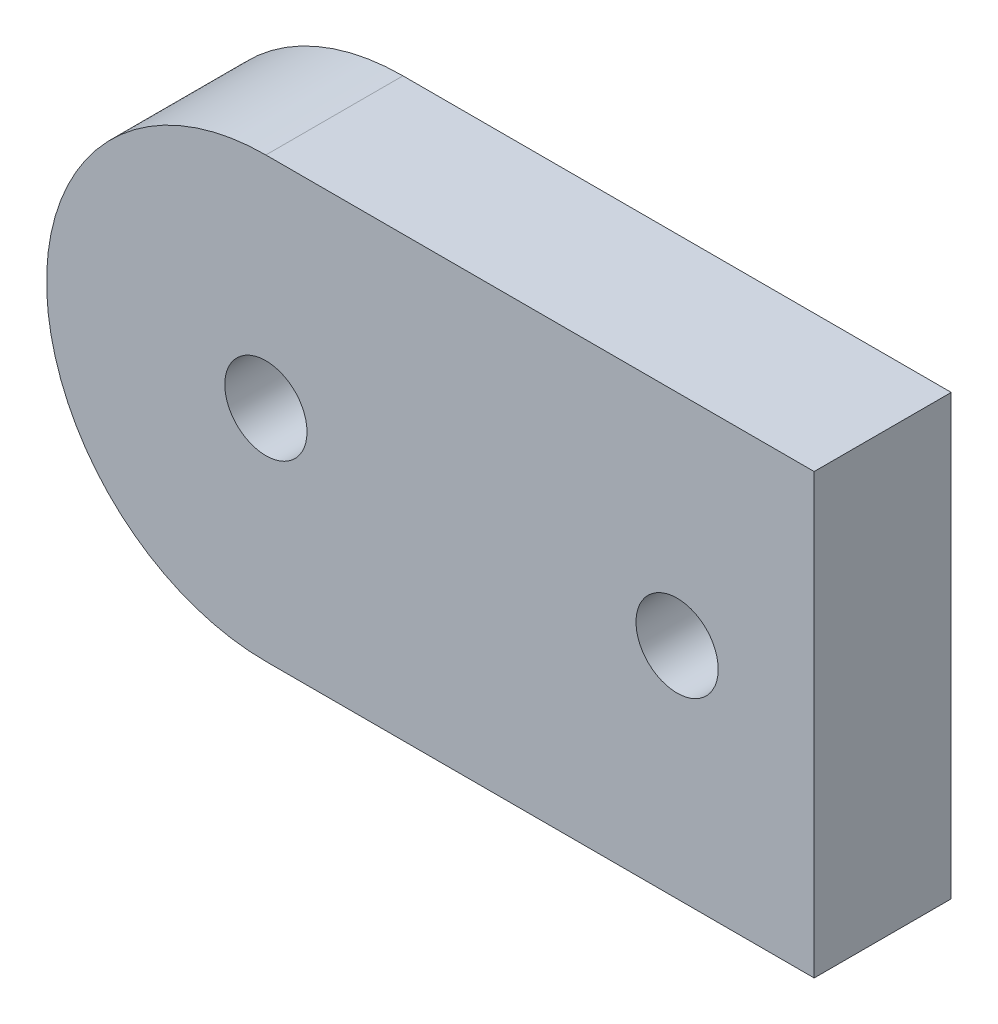
ISO-10303-21;
HEADER;
FILE_DESCRIPTION(('STEP AP214'),'2;1');
FILE_NAME('part.step','',(''),(''),'','','');
FILE_SCHEMA(('AUTOMOTIVE_DESIGN { 1 0 10303 214 1 1 1 1 }'));
ENDSEC;
DATA;
#1=APPLICATION_CONTEXT('core data for automotive mechanical design processes');
#2=APPLICATION_PROTOCOL_DEFINITION('international standard','automotive_design',2000,#1);
#3=PRODUCT_CONTEXT('',#1,'mechanical');
#4=PRODUCT('Part','Part','',(#3));
#5=PRODUCT_RELATED_PRODUCT_CATEGORY('part','',(#4));
#6=PRODUCT_DEFINITION_FORMATION('','',#4);
#7=PRODUCT_DEFINITION_CONTEXT('part definition',#1,'design');
#8=PRODUCT_DEFINITION('design','',#6,#7);
#9=PRODUCT_DEFINITION_SHAPE('','',#8);
#10=(LENGTH_UNIT() NAMED_UNIT(*) SI_UNIT(.MILLI.,.METRE.));
#11=(NAMED_UNIT(*) PLANE_ANGLE_UNIT() SI_UNIT($,.RADIAN.));
#12=(NAMED_UNIT(*) SI_UNIT($,.STERADIAN.) SOLID_ANGLE_UNIT());
#13=UNCERTAINTY_MEASURE_WITH_UNIT(LENGTH_MEASURE(1.E-05),#10,'distance_accuracy_value','');
#14=(GEOMETRIC_REPRESENTATION_CONTEXT(3) GLOBAL_UNCERTAINTY_ASSIGNED_CONTEXT((#13)) GLOBAL_UNIT_ASSIGNED_CONTEXT((#10,
#11,#12)) REPRESENTATION_CONTEXT('',''));
#15=CARTESIAN_POINT('',(0.,0.,0.));
#16=DIRECTION('',(0.,0.,1.));
#17=DIRECTION('',(1.,0.,0.));
#18=AXIS2_PLACEMENT_3D('',#15,#16,#17);
#19=CARTESIAN_POINT('',(0.,0.,5.));
#20=DIRECTION('',(0.,0.,1.));
#21=DIRECTION('',(1.,0.,0.));
#22=AXIS2_PLACEMENT_3D('',#19,#20,#21);
#23=PLANE('',#22);
#24=CARTESIAN_POINT('',(0.,0.,5.));
#25=DIRECTION('',(0.,0.,1.));
#26=DIRECTION('',(1.,0.,0.));
#27=AXIS2_PLACEMENT_3D('',#24,#25,#26);
#28=CIRCLE('',#27,1.5);
#29=CARTESIAN_POINT('',(1.5,0.,5.));
#30=VERTEX_POINT('',#29);
#31=EDGE_CURVE('E100',#30,#30,#28,.T.);
#32=ORIENTED_EDGE('',*,*,#31,.F.);
#33=EDGE_LOOP('',(#32));
#34=FACE_BOUND('',#33,.T.);
#35=CARTESIAN_POINT('',(0.,0.,5.));
#36=DIRECTION('',(0.,0.,1.));
#37=DIRECTION('',(1.,0.,0.));
#38=AXIS2_PLACEMENT_3D('',#35,#36,#37);
#39=CIRCLE('',#38,8.);
#40=CARTESIAN_POINT('',(0.,8.,5.));
#41=VERTEX_POINT('',#40);
#42=CARTESIAN_POINT('',(0.,-8.,5.));
#43=VERTEX_POINT('',#42);
#44=EDGE_CURVE('E85',#41,#43,#39,.T.);
#45=ORIENTED_EDGE('',*,*,#44,.T.);
#46=DIRECTION('',(1.,0.,0.));
#47=VECTOR('',#46,1.);
#48=CARTESIAN_POINT('',(0.,-8.,5.));
#49=LINE('',#48,#47);
#50=CARTESIAN_POINT('',(20.,-8.,5.));
#51=VERTEX_POINT('',#50);
#52=EDGE_CURVE('E80',#43,#51,#49,.T.);
#53=ORIENTED_EDGE('',*,*,#52,.T.);
#54=DIRECTION('',(0.,1.,0.));
#55=VECTOR('',#54,1.);
#56=CARTESIAN_POINT('',(20.,-8.,5.));
#57=LINE('',#56,#55);
#58=CARTESIAN_POINT('',(20.,8.,5.));
#59=VERTEX_POINT('',#58);
#60=EDGE_CURVE('E83',#51,#59,#57,.T.);
#61=ORIENTED_EDGE('',*,*,#60,.T.);
#62=DIRECTION('',(-1.,0.,0.));
#63=VECTOR('',#62,1.);
#64=CARTESIAN_POINT('',(0.,8.,5.));
#65=LINE('',#64,#63);
#66=EDGE_CURVE('E50',#59,#41,#65,.T.);
#67=ORIENTED_EDGE('',*,*,#66,.T.);
#68=EDGE_LOOP('',(#45,#53,#61,#67));
#69=FACE_BOUND('',#68,.T.);
#70=CARTESIAN_POINT('',(15.,0.,5.));
#71=DIRECTION('',(0.,0.,1.));
#72=DIRECTION('',(1.,0.,0.));
#73=AXIS2_PLACEMENT_3D('',#70,#71,#72);
#74=CIRCLE('',#73,1.5);
#75=CARTESIAN_POINT('',(16.5,0.,5.));
#76=VERTEX_POINT('',#75);
#77=EDGE_CURVE('E115',#76,#76,#74,.T.);
#78=ORIENTED_EDGE('',*,*,#77,.F.);
#79=EDGE_LOOP('',(#78));
#80=FACE_BOUND('',#79,.T.);
#81=ADVANCED_FACE('F33',(#34,#69,#80),#23,.T.);
#82=CARTESIAN_POINT('',(0.,0.,0.));
#83=DIRECTION('',(0.,0.,1.));
#84=DIRECTION('',(1.,0.,0.));
#85=AXIS2_PLACEMENT_3D('',#82,#83,#84);
#86=PLANE('',#85);
#87=CARTESIAN_POINT('',(0.,0.,0.));
#88=DIRECTION('',(0.,0.,1.));
#89=DIRECTION('',(1.,0.,0.));
#90=AXIS2_PLACEMENT_3D('',#87,#88,#89);
#91=CIRCLE('',#90,1.5);
#92=CARTESIAN_POINT('',(1.5,0.,0.));
#93=VERTEX_POINT('',#92);
#94=EDGE_CURVE('E112',#93,#93,#91,.T.);
#95=ORIENTED_EDGE('',*,*,#94,.T.);
#96=EDGE_LOOP('',(#95));
#97=FACE_BOUND('',#96,.T.);
#98=CARTESIAN_POINT('',(0.,0.,0.));
#99=DIRECTION('',(0.,0.,1.));
#100=DIRECTION('',(1.,0.,0.));
#101=AXIS2_PLACEMENT_3D('',#98,#99,#100);
#102=CIRCLE('',#101,8.);
#103=CARTESIAN_POINT('',(0.,8.,0.));
#104=VERTEX_POINT('',#103);
#105=CARTESIAN_POINT('',(0.,-8.,0.));
#106=VERTEX_POINT('',#105);
#107=EDGE_CURVE('E97',#104,#106,#102,.T.);
#108=ORIENTED_EDGE('',*,*,#107,.F.);
#109=DIRECTION('',(-1.,0.,0.));
#110=VECTOR('',#109,1.);
#111=CARTESIAN_POINT('',(0.,8.,0.));
#112=LINE('',#111,#110);
#113=CARTESIAN_POINT('',(20.,8.,0.));
#114=VERTEX_POINT('',#113);
#115=EDGE_CURVE('E73',#114,#104,#112,.T.);
#116=ORIENTED_EDGE('',*,*,#115,.F.);
#117=DIRECTION('',(0.,1.,0.));
#118=VECTOR('',#117,1.);
#119=CARTESIAN_POINT('',(20.,-8.,0.));
#120=LINE('',#119,#118);
#121=CARTESIAN_POINT('',(20.,-8.,0.));
#122=VERTEX_POINT('',#121);
#123=EDGE_CURVE('E67',#122,#114,#120,.T.);
#124=ORIENTED_EDGE('',*,*,#123,.F.);
#125=DIRECTION('',(1.,0.,0.));
#126=VECTOR('',#125,1.);
#127=CARTESIAN_POINT('',(0.,-8.,0.));
#128=LINE('',#127,#126);
#129=EDGE_CURVE('E89',#106,#122,#128,.T.);
#130=ORIENTED_EDGE('',*,*,#129,.F.);
#131=EDGE_LOOP('',(#108,#116,#124,#130));
#132=FACE_BOUND('',#131,.T.);
#133=CARTESIAN_POINT('',(15.,0.,0.));
#134=DIRECTION('',(0.,0.,1.));
#135=DIRECTION('',(1.,0.,0.));
#136=AXIS2_PLACEMENT_3D('',#133,#134,#135);
#137=CIRCLE('',#136,1.5);
#138=CARTESIAN_POINT('',(16.5,0.,0.));
#139=VERTEX_POINT('',#138);
#140=EDGE_CURVE('E118',#139,#139,#137,.T.);
#141=ORIENTED_EDGE('',*,*,#140,.T.);
#142=EDGE_LOOP('',(#141));
#143=FACE_BOUND('',#142,.T.);
#144=ADVANCED_FACE('F108',(#97,#132,#143),#86,.F.);
#145=CARTESIAN_POINT('',(0.,0.,5.));
#146=DIRECTION('',(0.,0.,-1.));
#147=DIRECTION('',(-1.,0.,0.));
#148=AXIS2_PLACEMENT_3D('',#145,#146,#147);
#149=CYLINDRICAL_SURFACE('',#148,8.);
#150=ORIENTED_EDGE('',*,*,#107,.T.);
#151=DIRECTION('',(0.,0.,-1.));
#152=VECTOR('',#151,1.);
#153=CARTESIAN_POINT('',(0.,-8.,5.));
#154=LINE('',#153,#152);
#155=EDGE_CURVE('E11',#43,#106,#154,.T.);
#156=ORIENTED_EDGE('',*,*,#155,.F.);
#157=ORIENTED_EDGE('',*,*,#44,.F.);
#158=DIRECTION('',(0.,0.,-1.));
#159=VECTOR('',#158,1.);
#160=CARTESIAN_POINT('',(0.,8.,5.));
#161=LINE('',#160,#159);
#162=EDGE_CURVE('E93',#41,#104,#161,.T.);
#163=ORIENTED_EDGE('',*,*,#162,.T.);
#164=EDGE_LOOP('',(#150,#156,#157,#163));
#165=FACE_BOUND('',#164,.T.);
#166=ADVANCED_FACE('F35',(#165),#149,.T.);
#167=CARTESIAN_POINT('',(0.,-8.,5.));
#168=DIRECTION('',(0.,1.,0.));
#169=DIRECTION('',(0.,0.,1.));
#170=AXIS2_PLACEMENT_3D('',#167,#168,#169);
#171=PLANE('',#170);
#172=ORIENTED_EDGE('',*,*,#129,.T.);
#173=DIRECTION('',(0.,0.,-1.));
#174=VECTOR('',#173,1.);
#175=CARTESIAN_POINT('',(20.,-8.,5.));
#176=LINE('',#175,#174);
#177=EDGE_CURVE('E42',#51,#122,#176,.T.);
#178=ORIENTED_EDGE('',*,*,#177,.F.);
#179=ORIENTED_EDGE('',*,*,#52,.F.);
#180=ORIENTED_EDGE('',*,*,#155,.T.);
#181=EDGE_LOOP('',(#172,#178,#179,#180));
#182=FACE_BOUND('',#181,.T.);
#183=ADVANCED_FACE('F88',(#182),#171,.F.);
#184=CARTESIAN_POINT('',(20.,-8.,5.));
#185=DIRECTION('',(-1.,0.,0.));
#186=DIRECTION('',(0.,0.,1.));
#187=AXIS2_PLACEMENT_3D('',#184,#185,#186);
#188=PLANE('',#187);
#189=ORIENTED_EDGE('',*,*,#123,.T.);
#190=DIRECTION('',(0.,0.,-1.));
#191=VECTOR('',#190,1.);
#192=CARTESIAN_POINT('',(20.,8.,5.));
#193=LINE('',#192,#191);
#194=EDGE_CURVE('E90',#59,#114,#193,.T.);
#195=ORIENTED_EDGE('',*,*,#194,.F.);
#196=ORIENTED_EDGE('',*,*,#60,.F.);
#197=ORIENTED_EDGE('',*,*,#177,.T.);
#198=EDGE_LOOP('',(#189,#195,#196,#197));
#199=FACE_BOUND('',#198,.T.);
#200=ADVANCED_FACE('F91',(#199),#188,.F.);
#201=CARTESIAN_POINT('',(0.,8.,5.));
#202=DIRECTION('',(0.,-1.,0.));
#203=DIRECTION('',(0.,0.,-1.));
#204=AXIS2_PLACEMENT_3D('',#201,#202,#203);
#205=PLANE('',#204);
#206=ORIENTED_EDGE('',*,*,#115,.T.);
#207=ORIENTED_EDGE('',*,*,#162,.F.);
#208=ORIENTED_EDGE('',*,*,#66,.F.);
#209=ORIENTED_EDGE('',*,*,#194,.T.);
#210=EDGE_LOOP('',(#206,#207,#208,#209));
#211=FACE_BOUND('',#210,.T.);
#212=ADVANCED_FACE('F105',(#211),#205,.F.);
#213=CARTESIAN_POINT('',(0.,0.,5.));
#214=DIRECTION('',(0.,0.,-1.));
#215=DIRECTION('',(-1.,0.,0.));
#216=AXIS2_PLACEMENT_3D('',#213,#214,#215);
#217=CYLINDRICAL_SURFACE('',#216,1.5);
#218=ORIENTED_EDGE('',*,*,#31,.T.);
#219=EDGE_LOOP('',(#218));
#220=FACE_BOUND('',#219,.T.);
#221=ORIENTED_EDGE('',*,*,#94,.F.);
#222=EDGE_LOOP('',(#221));
#223=FACE_BOUND('',#222,.T.);
#224=ADVANCED_FACE('F136',(#220,#223),#217,.F.);
#225=CARTESIAN_POINT('',(15.,0.,5.));
#226=DIRECTION('',(0.,0.,-1.));
#227=DIRECTION('',(-1.,0.,0.));
#228=AXIS2_PLACEMENT_3D('',#225,#226,#227);
#229=CYLINDRICAL_SURFACE('',#228,1.5);
#230=ORIENTED_EDGE('',*,*,#77,.T.);
#231=EDGE_LOOP('',(#230));
#232=FACE_BOUND('',#231,.T.);
#233=ORIENTED_EDGE('',*,*,#140,.F.);
#234=EDGE_LOOP('',(#233));
#235=FACE_BOUND('',#234,.T.);
#236=ADVANCED_FACE('F124',(#232,#235),#229,.F.);
#237=CLOSED_SHELL('',(#81,#144,#166,#183,#200,#212,#224,#236));
#238=MANIFOLD_SOLID_BREP('B2',#237);
#239=ADVANCED_BREP_SHAPE_REPRESENTATION('',(#18,#238),#14);
#240=SHAPE_DEFINITION_REPRESENTATION(#9,#239);
ENDSEC;
END-ISO-10303-21;
